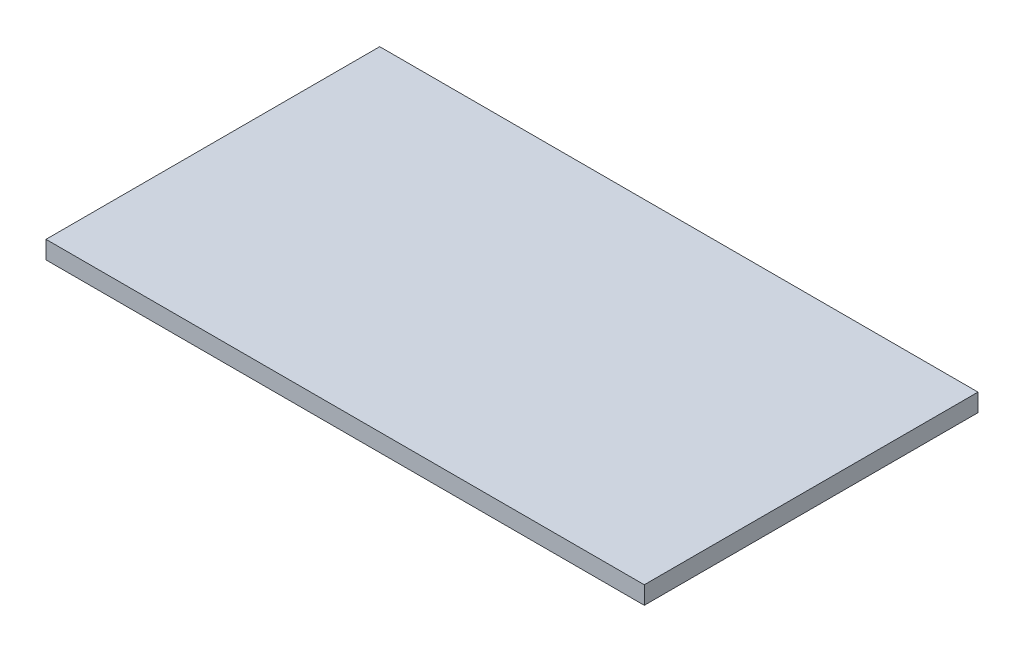
ISO-10303-21;
HEADER;
FILE_DESCRIPTION(('STEP AP214'),'2;1');
FILE_NAME('part.step','',(''),(''),'','','');
FILE_SCHEMA(('AUTOMOTIVE_DESIGN { 1 0 10303 214 1 1 1 1 }'));
ENDSEC;
DATA;
#1=APPLICATION_CONTEXT('core data for automotive mechanical design processes');
#2=APPLICATION_PROTOCOL_DEFINITION('international standard','automotive_design',2000,#1);
#3=PRODUCT_CONTEXT('',#1,'mechanical');
#4=PRODUCT('Part','Part','',(#3));
#5=PRODUCT_RELATED_PRODUCT_CATEGORY('part','',(#4));
#6=PRODUCT_DEFINITION_FORMATION('','',#4);
#7=PRODUCT_DEFINITION_CONTEXT('part definition',#1,'design');
#8=PRODUCT_DEFINITION('design','',#6,#7);
#9=PRODUCT_DEFINITION_SHAPE('','',#8);
#10=(LENGTH_UNIT() NAMED_UNIT(*) SI_UNIT(.MILLI.,.METRE.));
#11=(NAMED_UNIT(*) PLANE_ANGLE_UNIT() SI_UNIT($,.RADIAN.));
#12=(NAMED_UNIT(*) SI_UNIT($,.STERADIAN.) SOLID_ANGLE_UNIT());
#13=UNCERTAINTY_MEASURE_WITH_UNIT(LENGTH_MEASURE(1.E-05),#10,'distance_accuracy_value','');
#14=(GEOMETRIC_REPRESENTATION_CONTEXT(3) GLOBAL_UNCERTAINTY_ASSIGNED_CONTEXT((#13)) GLOBAL_UNIT_ASSIGNED_CONTEXT((#10,
#11,#12)) REPRESENTATION_CONTEXT('',''));
#15=CARTESIAN_POINT('',(0.,0.,0.));
#16=DIRECTION('',(0.,0.,1.));
#17=DIRECTION('',(1.,0.,0.));
#18=AXIS2_PLACEMENT_3D('',#15,#16,#17);
#19=CARTESIAN_POINT('',(0.,48.,0.));
#20=DIRECTION('',(1.,0.,0.));
#21=DIRECTION('',(0.,0.,-1.));
#22=AXIS2_PLACEMENT_3D('',#19,#20,#21);
#23=PLANE('',#22);
#24=DIRECTION('',(0.,0.,1.));
#25=VECTOR('',#24,1.);
#26=CARTESIAN_POINT('',(0.,0.,0.));
#27=LINE('',#26,#25);
#28=CARTESIAN_POINT('',(0.,0.,-898.));
#29=VERTEX_POINT('',#28);
#30=CARTESIAN_POINT('',(0.,0.,0.));
#31=VERTEX_POINT('',#30);
#32=EDGE_CURVE('E96',#29,#31,#27,.T.);
#33=ORIENTED_EDGE('',*,*,#32,.T.);
#34=DIRECTION('',(0.,-1.,0.));
#35=VECTOR('',#34,1.);
#36=CARTESIAN_POINT('',(0.,48.,0.));
#37=LINE('',#36,#35);
#38=CARTESIAN_POINT('',(0.,48.,0.));
#39=VERTEX_POINT('',#38);
#40=EDGE_CURVE('E11',#39,#31,#37,.T.);
#41=ORIENTED_EDGE('',*,*,#40,.F.);
#42=DIRECTION('',(0.,0.,1.));
#43=VECTOR('',#42,1.);
#44=CARTESIAN_POINT('',(0.,48.,0.));
#45=LINE('',#44,#43);
#46=CARTESIAN_POINT('',(0.,48.,-898.));
#47=VERTEX_POINT('',#46);
#48=EDGE_CURVE('E84',#47,#39,#45,.T.);
#49=ORIENTED_EDGE('',*,*,#48,.F.);
#50=DIRECTION('',(0.,-1.,0.));
#51=VECTOR('',#50,1.);
#52=CARTESIAN_POINT('',(0.,48.,-898.));
#53=LINE('',#52,#51);
#54=EDGE_CURVE('E92',#47,#29,#53,.T.);
#55=ORIENTED_EDGE('',*,*,#54,.T.);
#56=EDGE_LOOP('',(#33,#41,#49,#55));
#57=FACE_BOUND('',#56,.T.);
#58=ADVANCED_FACE('F33',(#57),#23,.F.);
#59=CARTESIAN_POINT('',(0.,48.,0.));
#60=DIRECTION('',(0.,0.,-1.));
#61=DIRECTION('',(-1.,0.,0.));
#62=AXIS2_PLACEMENT_3D('',#59,#60,#61);
#63=PLANE('',#62);
#64=DIRECTION('',(1.,0.,0.));
#65=VECTOR('',#64,1.);
#66=CARTESIAN_POINT('',(0.,0.,0.));
#67=LINE('',#66,#65);
#68=CARTESIAN_POINT('',(1610.,0.,0.));
#69=VERTEX_POINT('',#68);
#70=EDGE_CURVE('E88',#31,#69,#67,.T.);
#71=ORIENTED_EDGE('',*,*,#70,.T.);
#72=DIRECTION('',(0.,-1.,0.));
#73=VECTOR('',#72,1.);
#74=CARTESIAN_POINT('',(1610.,48.,0.));
#75=LINE('',#74,#73);
#76=CARTESIAN_POINT('',(1610.,48.,0.));
#77=VERTEX_POINT('',#76);
#78=EDGE_CURVE('E41',#77,#69,#75,.T.);
#79=ORIENTED_EDGE('',*,*,#78,.F.);
#80=DIRECTION('',(1.,0.,0.));
#81=VECTOR('',#80,1.);
#82=CARTESIAN_POINT('',(0.,48.,0.));
#83=LINE('',#82,#81);
#84=EDGE_CURVE('E79',#39,#77,#83,.T.);
#85=ORIENTED_EDGE('',*,*,#84,.F.);
#86=ORIENTED_EDGE('',*,*,#40,.T.);
#87=EDGE_LOOP('',(#71,#79,#85,#86));
#88=FACE_BOUND('',#87,.T.);
#89=ADVANCED_FACE('F87',(#88),#63,.F.);
#90=CARTESIAN_POINT('',(1610.,48.,0.));
#91=DIRECTION('',(-1.,0.,0.));
#92=DIRECTION('',(0.,0.,1.));
#93=AXIS2_PLACEMENT_3D('',#90,#91,#92);
#94=PLANE('',#93);
#95=DIRECTION('',(0.,0.,-1.));
#96=VECTOR('',#95,1.);
#97=CARTESIAN_POINT('',(1610.,0.,0.));
#98=LINE('',#97,#96);
#99=CARTESIAN_POINT('',(1610.,0.,-898.));
#100=VERTEX_POINT('',#99);
#101=EDGE_CURVE('E66',#69,#100,#98,.T.);
#102=ORIENTED_EDGE('',*,*,#101,.T.);
#103=DIRECTION('',(0.,-1.,0.));
#104=VECTOR('',#103,1.);
#105=CARTESIAN_POINT('',(1610.,48.,-898.));
#106=LINE('',#105,#104);
#107=CARTESIAN_POINT('',(1610.,48.,-898.));
#108=VERTEX_POINT('',#107);
#109=EDGE_CURVE('E89',#108,#100,#106,.T.);
#110=ORIENTED_EDGE('',*,*,#109,.F.);
#111=DIRECTION('',(0.,0.,-1.));
#112=VECTOR('',#111,1.);
#113=CARTESIAN_POINT('',(1610.,48.,0.));
#114=LINE('',#113,#112);
#115=EDGE_CURVE('E82',#77,#108,#114,.T.);
#116=ORIENTED_EDGE('',*,*,#115,.F.);
#117=ORIENTED_EDGE('',*,*,#78,.T.);
#118=EDGE_LOOP('',(#102,#110,#116,#117));
#119=FACE_BOUND('',#118,.T.);
#120=ADVANCED_FACE('F90',(#119),#94,.F.);
#121=CARTESIAN_POINT('',(0.,48.,-898.));
#122=DIRECTION('',(0.,0.,1.));
#123=DIRECTION('',(1.,0.,0.));
#124=AXIS2_PLACEMENT_3D('',#121,#122,#123);
#125=PLANE('',#124);
#126=DIRECTION('',(-1.,0.,0.));
#127=VECTOR('',#126,1.);
#128=CARTESIAN_POINT('',(0.,0.,-898.));
#129=LINE('',#128,#127);
#130=EDGE_CURVE('E72',#100,#29,#129,.T.);
#131=ORIENTED_EDGE('',*,*,#130,.T.);
#132=ORIENTED_EDGE('',*,*,#54,.F.);
#133=DIRECTION('',(-1.,0.,0.));
#134=VECTOR('',#133,1.);
#135=CARTESIAN_POINT('',(0.,48.,-898.));
#136=LINE('',#135,#134);
#137=EDGE_CURVE('E49',#108,#47,#136,.T.);
#138=ORIENTED_EDGE('',*,*,#137,.F.);
#139=ORIENTED_EDGE('',*,*,#109,.T.);
#140=EDGE_LOOP('',(#131,#132,#138,#139));
#141=FACE_BOUND('',#140,.T.);
#142=ADVANCED_FACE('F103',(#141),#125,.F.);
#143=CARTESIAN_POINT('',(0.,48.,0.));
#144=DIRECTION('',(0.,-1.,0.));
#145=DIRECTION('',(0.,0.,-1.));
#146=AXIS2_PLACEMENT_3D('',#143,#144,#145);
#147=PLANE('',#146);
#148=ORIENTED_EDGE('',*,*,#48,.T.);
#149=ORIENTED_EDGE('',*,*,#84,.T.);
#150=ORIENTED_EDGE('',*,*,#115,.T.);
#151=ORIENTED_EDGE('',*,*,#137,.T.);
#152=EDGE_LOOP('',(#148,#149,#150,#151));
#153=FACE_BOUND('',#152,.T.);
#154=ADVANCED_FACE('F80',(#153),#147,.F.);
#155=CARTESIAN_POINT('',(0.,0.,0.));
#156=DIRECTION('',(0.,-1.,0.));
#157=DIRECTION('',(0.,0.,-1.));
#158=AXIS2_PLACEMENT_3D('',#155,#156,#157);
#159=PLANE('',#158);
#160=ORIENTED_EDGE('',*,*,#32,.F.);
#161=ORIENTED_EDGE('',*,*,#130,.F.);
#162=ORIENTED_EDGE('',*,*,#101,.F.);
#163=ORIENTED_EDGE('',*,*,#70,.F.);
#164=EDGE_LOOP('',(#160,#161,#162,#163));
#165=FACE_BOUND('',#164,.T.);
#166=ADVANCED_FACE('F106',(#165),#159,.T.);
#167=CLOSED_SHELL('',(#58,#89,#120,#142,#154,#166));
#168=MANIFOLD_SOLID_BREP('B2',#167);
#169=ADVANCED_BREP_SHAPE_REPRESENTATION('',(#18,#168),#14);
#170=SHAPE_DEFINITION_REPRESENTATION(#9,#169);
ENDSEC;
END-ISO-10303-21;
